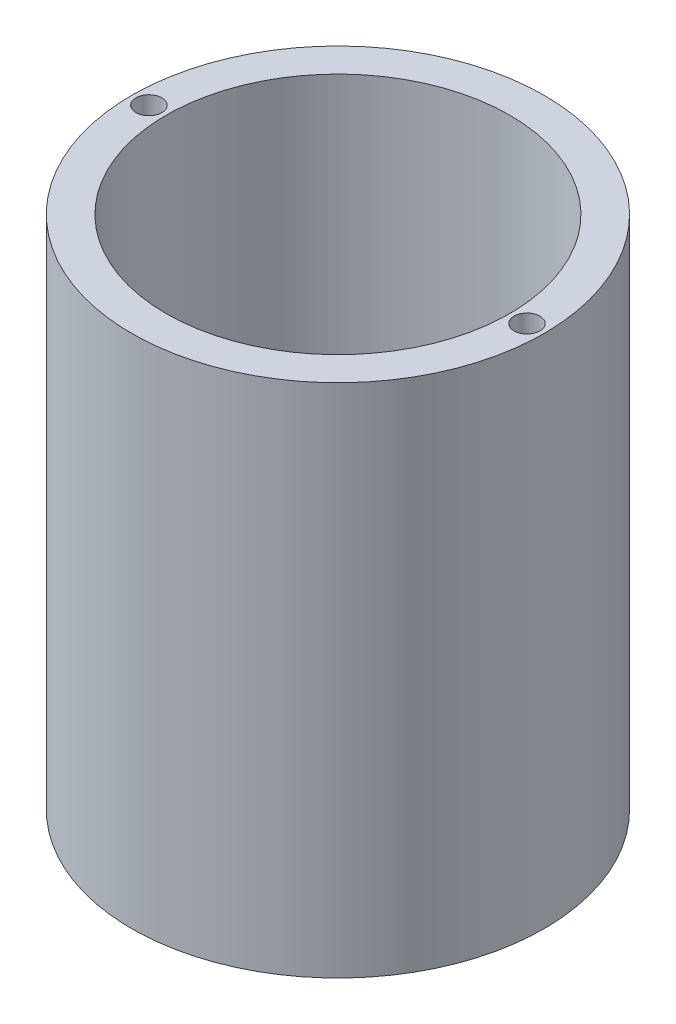
ISO-10303-21;
HEADER;
FILE_DESCRIPTION(('STEP AP214'),'2;1');
FILE_NAME('part.step','',(''),(''),'','','');
FILE_SCHEMA(('AUTOMOTIVE_DESIGN { 1 0 10303 214 1 1 1 1 }'));
ENDSEC;
DATA;
#1=APPLICATION_CONTEXT('core data for automotive mechanical design processes');
#2=APPLICATION_PROTOCOL_DEFINITION('international standard','automotive_design',2000,#1);
#3=PRODUCT_CONTEXT('',#1,'mechanical');
#4=PRODUCT('Part','Part','',(#3));
#5=PRODUCT_RELATED_PRODUCT_CATEGORY('part','',(#4));
#6=PRODUCT_DEFINITION_FORMATION('','',#4);
#7=PRODUCT_DEFINITION_CONTEXT('part definition',#1,'design');
#8=PRODUCT_DEFINITION('design','',#6,#7);
#9=PRODUCT_DEFINITION_SHAPE('','',#8);
#10=(LENGTH_UNIT() NAMED_UNIT(*) SI_UNIT(.MILLI.,.METRE.));
#11=(NAMED_UNIT(*) PLANE_ANGLE_UNIT() SI_UNIT($,.RADIAN.));
#12=(NAMED_UNIT(*) SI_UNIT($,.STERADIAN.) SOLID_ANGLE_UNIT());
#13=UNCERTAINTY_MEASURE_WITH_UNIT(LENGTH_MEASURE(1.E-05),#10,'distance_accuracy_value','');
#14=(GEOMETRIC_REPRESENTATION_CONTEXT(3) GLOBAL_UNCERTAINTY_ASSIGNED_CONTEXT((#13)) GLOBAL_UNIT_ASSIGNED_CONTEXT((#10,
#11,#12)) REPRESENTATION_CONTEXT('',''));
#15=CARTESIAN_POINT('',(0.,0.,0.));
#16=DIRECTION('',(0.,0.,1.));
#17=DIRECTION('',(1.,0.,0.));
#18=AXIS2_PLACEMENT_3D('',#15,#16,#17);
#19=CARTESIAN_POINT('',(0.,38.1,0.));
#20=DIRECTION('',(0.,1.,0.));
#21=DIRECTION('',(0.,0.,1.));
#22=AXIS2_PLACEMENT_3D('',#19,#20,#21);
#23=PLANE('',#22);
#24=CARTESIAN_POINT('',(13.97,38.1,0.));
#25=DIRECTION('',(0.,1.,0.));
#26=DIRECTION('',(0.,0.,1.));
#27=AXIS2_PLACEMENT_3D('',#24,#25,#26);
#28=CIRCLE('',#27,0.9525);
#29=CARTESIAN_POINT('',(13.97,38.1,0.9525));
#30=VERTEX_POINT('',#29);
#31=EDGE_CURVE('E55',#30,#30,#28,.T.);
#32=ORIENTED_EDGE('',*,*,#31,.F.);
#33=EDGE_LOOP('',(#32));
#34=FACE_BOUND('',#33,.T.);
#35=CARTESIAN_POINT('',(-13.97,38.1,0.));
#36=DIRECTION('',(0.,1.,0.));
#37=DIRECTION('',(0.,0.,1.));
#38=AXIS2_PLACEMENT_3D('',#35,#36,#37);
#39=CIRCLE('',#38,0.9525);
#40=CARTESIAN_POINT('',(-13.97,38.1,0.9525));
#41=VERTEX_POINT('',#40);
#42=EDGE_CURVE('E49',#41,#41,#39,.T.);
#43=ORIENTED_EDGE('',*,*,#42,.F.);
#44=EDGE_LOOP('',(#43));
#45=FACE_BOUND('',#44,.T.);
#46=CARTESIAN_POINT('',(0.,38.1,0.));
#47=DIRECTION('',(0.,1.,0.));
#48=DIRECTION('',(0.,0.,1.));
#49=AXIS2_PLACEMENT_3D('',#46,#47,#48);
#50=CIRCLE('',#49,15.24);
#51=CARTESIAN_POINT('',(0.,38.1,-15.24));
#52=VERTEX_POINT('',#51);
#53=EDGE_CURVE('E10',#52,#52,#50,.T.);
#54=ORIENTED_EDGE('',*,*,#53,.T.);
#55=EDGE_LOOP('',(#54));
#56=FACE_BOUND('',#55,.T.);
#57=CARTESIAN_POINT('',(0.,38.1,0.));
#58=DIRECTION('',(0.,1.,0.));
#59=DIRECTION('',(0.,0.,1.));
#60=AXIS2_PLACEMENT_3D('',#57,#58,#59);
#61=CIRCLE('',#60,12.7);
#62=CARTESIAN_POINT('',(0.,38.1,-12.7));
#63=VERTEX_POINT('',#62);
#64=EDGE_CURVE('E41',#63,#63,#61,.T.);
#65=ORIENTED_EDGE('',*,*,#64,.F.);
#66=EDGE_LOOP('',(#65));
#67=FACE_BOUND('',#66,.T.);
#68=ADVANCED_FACE('F30',(#34,#45,#56,#67),#23,.T.);
#69=CARTESIAN_POINT('',(0.,0.,0.));
#70=DIRECTION('',(0.,1.,0.));
#71=DIRECTION('',(0.,0.,1.));
#72=AXIS2_PLACEMENT_3D('',#69,#70,#71);
#73=PLANE('',#72);
#74=CARTESIAN_POINT('',(0.,0.,0.));
#75=DIRECTION('',(0.,1.,0.));
#76=DIRECTION('',(0.,0.,1.));
#77=AXIS2_PLACEMENT_3D('',#74,#75,#76);
#78=CIRCLE('',#77,15.24);
#79=CARTESIAN_POINT('',(0.,0.,-15.24));
#80=VERTEX_POINT('',#79);
#81=EDGE_CURVE('E34',#80,#80,#78,.T.);
#82=ORIENTED_EDGE('',*,*,#81,.F.);
#83=EDGE_LOOP('',(#82));
#84=FACE_BOUND('',#83,.T.);
#85=CARTESIAN_POINT('',(0.,0.,0.));
#86=DIRECTION('',(0.,1.,0.));
#87=DIRECTION('',(0.,0.,1.));
#88=AXIS2_PLACEMENT_3D('',#85,#86,#87);
#89=CIRCLE('',#88,12.7);
#90=CARTESIAN_POINT('',(0.,0.,-12.7));
#91=VERTEX_POINT('',#90);
#92=EDGE_CURVE('E43',#91,#91,#89,.T.);
#93=ORIENTED_EDGE('',*,*,#92,.T.);
#94=EDGE_LOOP('',(#93));
#95=FACE_BOUND('',#94,.T.);
#96=ADVANCED_FACE('F72',(#84,#95),#73,.F.);
#97=CARTESIAN_POINT('',(0.,38.1,0.));
#98=DIRECTION('',(0.,-1.,0.));
#99=DIRECTION('',(0.,0.,-1.));
#100=AXIS2_PLACEMENT_3D('',#97,#98,#99);
#101=CYLINDRICAL_SURFACE('',#100,15.24);
#102=CARTESIAN_POINT('',(0.,38.1,-15.24));
#103=CARTESIAN_POINT('',(0.,37.703125,-15.24));
#104=CARTESIAN_POINT('',(0.,37.30625,-15.24));
#105=CARTESIAN_POINT('',(0.,36.5125,-15.24));
#106=CARTESIAN_POINT('',(0.,36.115625,-15.24));
#107=CARTESIAN_POINT('',(0.,35.321875,-15.24));
#108=CARTESIAN_POINT('',(0.,34.925,-15.24));
#109=CARTESIAN_POINT('',(0.,34.13125,-15.24));
#110=CARTESIAN_POINT('',(0.,33.734375,-15.24));
#111=CARTESIAN_POINT('',(0.,32.940625,-15.24));
#112=CARTESIAN_POINT('',(0.,32.54375,-15.24));
#113=CARTESIAN_POINT('',(0.,31.75,-15.24));
#114=CARTESIAN_POINT('',(0.,31.353125,-15.24));
#115=CARTESIAN_POINT('',(0.,30.559375,-15.24));
#116=CARTESIAN_POINT('',(0.,30.1625,-15.24));
#117=CARTESIAN_POINT('',(0.,29.36875,-15.24));
#118=CARTESIAN_POINT('',(0.,28.971875,-15.24));
#119=CARTESIAN_POINT('',(0.,28.178125,-15.24));
#120=CARTESIAN_POINT('',(0.,27.78125,-15.24));
#121=CARTESIAN_POINT('',(0.,26.9875,-15.24));
#122=CARTESIAN_POINT('',(0.,26.590625,-15.24));
#123=CARTESIAN_POINT('',(0.,25.796875,-15.24));
#124=CARTESIAN_POINT('',(0.,25.4,-15.24));
#125=CARTESIAN_POINT('',(0.,24.60625,-15.24));
#126=CARTESIAN_POINT('',(0.,24.209375,-15.24));
#127=CARTESIAN_POINT('',(0.,23.415625,-15.24));
#128=CARTESIAN_POINT('',(0.,23.01875,-15.24));
#129=CARTESIAN_POINT('',(0.,22.225,-15.24));
#130=CARTESIAN_POINT('',(0.,21.828125,-15.24));
#131=CARTESIAN_POINT('',(0.,21.034375,-15.24));
#132=CARTESIAN_POINT('',(0.,20.6375,-15.24));
#133=CARTESIAN_POINT('',(0.,19.84375,-15.24));
#134=CARTESIAN_POINT('',(0.,19.446875,-15.24));
#135=CARTESIAN_POINT('',(0.,18.653125,-15.24));
#136=CARTESIAN_POINT('',(0.,18.25625,-15.24));
#137=CARTESIAN_POINT('',(0.,17.4625,-15.24));
#138=CARTESIAN_POINT('',(0.,17.065625,-15.24));
#139=CARTESIAN_POINT('',(0.,16.271875,-15.24));
#140=CARTESIAN_POINT('',(0.,15.875,-15.24));
#141=CARTESIAN_POINT('',(0.,15.08125,-15.24));
#142=CARTESIAN_POINT('',(0.,14.684375,-15.24));
#143=CARTESIAN_POINT('',(0.,13.890625,-15.24));
#144=CARTESIAN_POINT('',(0.,13.49375,-15.24));
#145=CARTESIAN_POINT('',(0.,12.7,-15.24));
#146=CARTESIAN_POINT('',(0.,12.303125,-15.24));
#147=CARTESIAN_POINT('',(0.,11.509375,-15.24));
#148=CARTESIAN_POINT('',(0.,11.1125,-15.24));
#149=CARTESIAN_POINT('',(0.,10.31875,-15.24));
#150=CARTESIAN_POINT('',(0.,9.921875,-15.24));
#151=CARTESIAN_POINT('',(0.,9.128125,-15.24));
#152=CARTESIAN_POINT('',(0.,8.73125,-15.24));
#153=CARTESIAN_POINT('',(0.,7.9375,-15.24));
#154=CARTESIAN_POINT('',(0.,7.540625,-15.24));
#155=CARTESIAN_POINT('',(0.,6.746875,-15.24));
#156=CARTESIAN_POINT('',(0.,6.35,-15.24));
#157=CARTESIAN_POINT('',(0.,5.55625,-15.24));
#158=CARTESIAN_POINT('',(0.,5.159375,-15.24));
#159=CARTESIAN_POINT('',(0.,4.365625,-15.24));
#160=CARTESIAN_POINT('',(0.,3.96875,-15.24));
#161=CARTESIAN_POINT('',(0.,3.175,-15.24));
#162=CARTESIAN_POINT('',(0.,2.778125,-15.24));
#163=CARTESIAN_POINT('',(0.,1.984375,-15.24));
#164=CARTESIAN_POINT('',(0.,1.5875,-15.24));
#165=CARTESIAN_POINT('',(0.,0.79375,-15.24));
#166=CARTESIAN_POINT('',(0.,0.396875,-15.24));
#167=CARTESIAN_POINT('',(0.,0.,-15.24));
#168=B_SPLINE_CURVE_WITH_KNOTS('',3,(#102,#103,#104,#105,#106,#107,#108,#109,#110,#111,#112,
#113,#114,#115,#116,#117,#118,#119,#120,#121,#122,#123,#124,#125,#126,#127,#128,#129,#130,#131,
#132,#133,#134,#135,#136,#137,#138,#139,#140,#141,#142,#143,#144,#145,#146,#147,#148,#149,#150,
#151,#152,#153,#154,#155,#156,#157,#158,#159,#160,#161,#162,#163,#164,#165,#166,#167),
.UNSPECIFIED.,.F.,.F.,(4,2,2,2,2,2,2,2,2,2,2,2,2,2,2,2,2,2,2,2,2,2,2,2,2,2,2,2,2,2,2,2,4),(0.,
1.19062499999999,2.38124999999999,3.571875,4.7625,5.953125,7.14375,8.33437499999999,9.525,
10.715625,11.90625,13.096875,14.2875,15.478125,16.66875,17.859375,19.05,20.240625,21.43125,
22.621875,23.8125,25.003125,26.19375,27.384375,28.575,29.765625,30.95625,32.146875,33.3375,
34.528125,35.71875,36.909375,38.1),.UNSPECIFIED.);
#169=EDGE_CURVE('BSEAM32',#52,#80,#168,.T.);
#170=ORIENTED_EDGE('',*,*,#53,.F.);
#171=ORIENTED_EDGE('',*,*,#81,.T.);
#172=ORIENTED_EDGE('',*,*,#169,.T.);
#173=ORIENTED_EDGE('',*,*,#169,.F.);
#174=EDGE_LOOP('',(#170,#172,#171,#173));
#175=FACE_BOUND('',#174,.T.);
#176=ADVANCED_FACE('F32',(#175),#101,.T.);
#177=CARTESIAN_POINT('',(0.,38.1,0.));
#178=DIRECTION('',(0.,-1.,0.));
#179=DIRECTION('',(0.,0.,-1.));
#180=AXIS2_PLACEMENT_3D('',#177,#178,#179);
#181=CYLINDRICAL_SURFACE('',#180,12.7);
#182=CARTESIAN_POINT('',(0.,38.1,-12.7));
#183=CARTESIAN_POINT('',(0.,37.703125,-12.7));
#184=CARTESIAN_POINT('',(0.,37.30625,-12.7));
#185=CARTESIAN_POINT('',(0.,36.5125,-12.7));
#186=CARTESIAN_POINT('',(0.,36.115625,-12.7));
#187=CARTESIAN_POINT('',(0.,35.321875,-12.7));
#188=CARTESIAN_POINT('',(0.,34.925,-12.7));
#189=CARTESIAN_POINT('',(0.,34.13125,-12.7));
#190=CARTESIAN_POINT('',(0.,33.734375,-12.7));
#191=CARTESIAN_POINT('',(0.,32.940625,-12.7));
#192=CARTESIAN_POINT('',(0.,32.54375,-12.7));
#193=CARTESIAN_POINT('',(0.,31.75,-12.7));
#194=CARTESIAN_POINT('',(0.,31.353125,-12.7));
#195=CARTESIAN_POINT('',(0.,30.559375,-12.7));
#196=CARTESIAN_POINT('',(0.,30.1625,-12.7));
#197=CARTESIAN_POINT('',(0.,29.36875,-12.7));
#198=CARTESIAN_POINT('',(0.,28.971875,-12.7));
#199=CARTESIAN_POINT('',(0.,28.178125,-12.7));
#200=CARTESIAN_POINT('',(0.,27.78125,-12.7));
#201=CARTESIAN_POINT('',(0.,26.9875,-12.7));
#202=CARTESIAN_POINT('',(0.,26.590625,-12.7));
#203=CARTESIAN_POINT('',(0.,25.796875,-12.7));
#204=CARTESIAN_POINT('',(0.,25.4,-12.7));
#205=CARTESIAN_POINT('',(0.,24.60625,-12.7));
#206=CARTESIAN_POINT('',(0.,24.209375,-12.7));
#207=CARTESIAN_POINT('',(0.,23.415625,-12.7));
#208=CARTESIAN_POINT('',(0.,23.01875,-12.7));
#209=CARTESIAN_POINT('',(0.,22.225,-12.7));
#210=CARTESIAN_POINT('',(0.,21.828125,-12.7));
#211=CARTESIAN_POINT('',(0.,21.034375,-12.7));
#212=CARTESIAN_POINT('',(0.,20.6375,-12.7));
#213=CARTESIAN_POINT('',(0.,19.84375,-12.7));
#214=CARTESIAN_POINT('',(0.,19.446875,-12.7));
#215=CARTESIAN_POINT('',(0.,18.653125,-12.7));
#216=CARTESIAN_POINT('',(0.,18.25625,-12.7));
#217=CARTESIAN_POINT('',(0.,17.4625,-12.7));
#218=CARTESIAN_POINT('',(0.,17.065625,-12.7));
#219=CARTESIAN_POINT('',(0.,16.271875,-12.7));
#220=CARTESIAN_POINT('',(0.,15.875,-12.7));
#221=CARTESIAN_POINT('',(0.,15.08125,-12.7));
#222=CARTESIAN_POINT('',(0.,14.684375,-12.7));
#223=CARTESIAN_POINT('',(0.,13.890625,-12.7));
#224=CARTESIAN_POINT('',(0.,13.49375,-12.7));
#225=CARTESIAN_POINT('',(0.,12.7,-12.7));
#226=CARTESIAN_POINT('',(0.,12.303125,-12.7));
#227=CARTESIAN_POINT('',(0.,11.509375,-12.7));
#228=CARTESIAN_POINT('',(0.,11.1125,-12.7));
#229=CARTESIAN_POINT('',(0.,10.31875,-12.7));
#230=CARTESIAN_POINT('',(0.,9.92187499999999,-12.7));
#231=CARTESIAN_POINT('',(0.,9.128125,-12.7));
#232=CARTESIAN_POINT('',(0.,8.73124999999999,-12.7));
#233=CARTESIAN_POINT('',(0.,7.93749999999999,-12.7));
#234=CARTESIAN_POINT('',(0.,7.54062499999999,-12.7));
#235=CARTESIAN_POINT('',(0.,6.746875,-12.7));
#236=CARTESIAN_POINT('',(0.,6.35,-12.7));
#237=CARTESIAN_POINT('',(0.,5.55625,-12.7));
#238=CARTESIAN_POINT('',(0.,5.159375,-12.7));
#239=CARTESIAN_POINT('',(0.,4.365625,-12.7));
#240=CARTESIAN_POINT('',(0.,3.96875,-12.7));
#241=CARTESIAN_POINT('',(0.,3.175,-12.7));
#242=CARTESIAN_POINT('',(0.,2.778125,-12.7));
#243=CARTESIAN_POINT('',(0.,1.984375,-12.7));
#244=CARTESIAN_POINT('',(0.,1.5875,-12.7));
#245=CARTESIAN_POINT('',(0.,0.79375,-12.7));
#246=CARTESIAN_POINT('',(0.,0.396875,-12.7));
#247=CARTESIAN_POINT('',(0.,0.,-12.7));
#248=B_SPLINE_CURVE_WITH_KNOTS('',3,(#182,#183,#184,#185,#186,#187,#188,#189,#190,#191,#192,
#193,#194,#195,#196,#197,#198,#199,#200,#201,#202,#203,#204,#205,#206,#207,#208,#209,#210,#211,
#212,#213,#214,#215,#216,#217,#218,#219,#220,#221,#222,#223,#224,#225,#226,#227,#228,#229,#230,
#231,#232,#233,#234,#235,#236,#237,#238,#239,#240,#241,#242,#243,#244,#245,#246,#247),
.UNSPECIFIED.,.F.,.F.,(4,2,2,2,2,2,2,2,2,2,2,2,2,2,2,2,2,2,2,2,2,2,2,2,2,2,2,2,2,2,2,2,4),(0.,
1.190625,2.38125,3.571875,4.7625,5.953125,7.14375,8.334375,9.52500000000001,10.715625,11.90625,
13.096875,14.2875,15.478125,16.66875,17.859375,19.05,20.240625,21.43125,22.621875,23.8125,
25.003125,26.19375,27.384375,28.575,29.765625,30.95625,32.146875,33.3375,34.528125,35.71875,
36.909375,38.1),.UNSPECIFIED.);
#249=EDGE_CURVE('BSEAM78',#63,#91,#248,.T.);
#250=ORIENTED_EDGE('',*,*,#64,.T.);
#251=ORIENTED_EDGE('',*,*,#92,.F.);
#252=ORIENTED_EDGE('',*,*,#249,.T.);
#253=ORIENTED_EDGE('',*,*,#249,.F.);
#254=EDGE_LOOP('',(#250,#252,#251,#253));
#255=FACE_BOUND('',#254,.T.);
#256=ADVANCED_FACE('F78',(#255),#181,.F.);
#257=CARTESIAN_POINT('',(-13.97,33.02,0.));
#258=DIRECTION('',(0.,1.,0.));
#259=DIRECTION('',(0.,0.,1.));
#260=AXIS2_PLACEMENT_3D('',#257,#258,#259);
#261=CYLINDRICAL_SURFACE('',#260,0.9525);
#262=CARTESIAN_POINT('',(-13.97,33.02,0.));
#263=DIRECTION('',(0.,1.,0.));
#264=DIRECTION('',(0.,0.,1.));
#265=AXIS2_PLACEMENT_3D('',#262,#263,#264);
#266=CIRCLE('',#265,0.9525);
#267=CARTESIAN_POINT('',(-13.97,33.02,0.9525));
#268=VERTEX_POINT('',#267);
#269=EDGE_CURVE('E46',#268,#268,#266,.T.);
#270=ORIENTED_EDGE('',*,*,#269,.F.);
#271=EDGE_LOOP('',(#270));
#272=FACE_BOUND('',#271,.T.);
#273=ORIENTED_EDGE('',*,*,#42,.T.);
#274=EDGE_LOOP('',(#273));
#275=FACE_BOUND('',#274,.T.);
#276=ADVANCED_FACE('F81',(#272,#275),#261,.F.);
#277=CARTESIAN_POINT('',(-13.97,33.02,0.));
#278=DIRECTION('',(0.,1.,0.));
#279=DIRECTION('',(0.,0.,1.));
#280=AXIS2_PLACEMENT_3D('',#277,#278,#279);
#281=PLANE('',#280);
#282=ORIENTED_EDGE('',*,*,#269,.T.);
#283=EDGE_LOOP('',(#282));
#284=FACE_BOUND('',#283,.T.);
#285=ADVANCED_FACE('F66',(#284),#281,.T.);
#286=CARTESIAN_POINT('',(13.97,33.02,0.));
#287=DIRECTION('',(0.,1.,0.));
#288=DIRECTION('',(0.,0.,1.));
#289=AXIS2_PLACEMENT_3D('',#286,#287,#288);
#290=CYLINDRICAL_SURFACE('',#289,0.9525);
#291=CARTESIAN_POINT('',(13.97,33.02,0.));
#292=DIRECTION('',(0.,1.,0.));
#293=DIRECTION('',(0.,0.,1.));
#294=AXIS2_PLACEMENT_3D('',#291,#292,#293);
#295=CIRCLE('',#294,0.9525);
#296=CARTESIAN_POINT('',(13.97,33.02,0.9525));
#297=VERTEX_POINT('',#296);
#298=EDGE_CURVE('E52',#297,#297,#295,.T.);
#299=ORIENTED_EDGE('',*,*,#298,.F.);
#300=EDGE_LOOP('',(#299));
#301=FACE_BOUND('',#300,.T.);
#302=ORIENTED_EDGE('',*,*,#31,.T.);
#303=EDGE_LOOP('',(#302));
#304=FACE_BOUND('',#303,.T.);
#305=ADVANCED_FACE('F63',(#301,#304),#290,.F.);
#306=CARTESIAN_POINT('',(13.97,33.02,0.));
#307=DIRECTION('',(0.,1.,0.));
#308=DIRECTION('',(0.,0.,1.));
#309=AXIS2_PLACEMENT_3D('',#306,#307,#308);
#310=PLANE('',#309);
#311=ORIENTED_EDGE('',*,*,#298,.T.);
#312=EDGE_LOOP('',(#311));
#313=FACE_BOUND('',#312,.T.);
#314=ADVANCED_FACE('F61',(#313),#310,.T.);
#315=CLOSED_SHELL('',(#68,#96,#176,#256,#276,#285,#305,#314));
#316=MANIFOLD_SOLID_BREP('B2',#315);
#317=ADVANCED_BREP_SHAPE_REPRESENTATION('',(#18,#316),#14);
#318=SHAPE_DEFINITION_REPRESENTATION(#9,#317);
ENDSEC;
END-ISO-10303-21;
